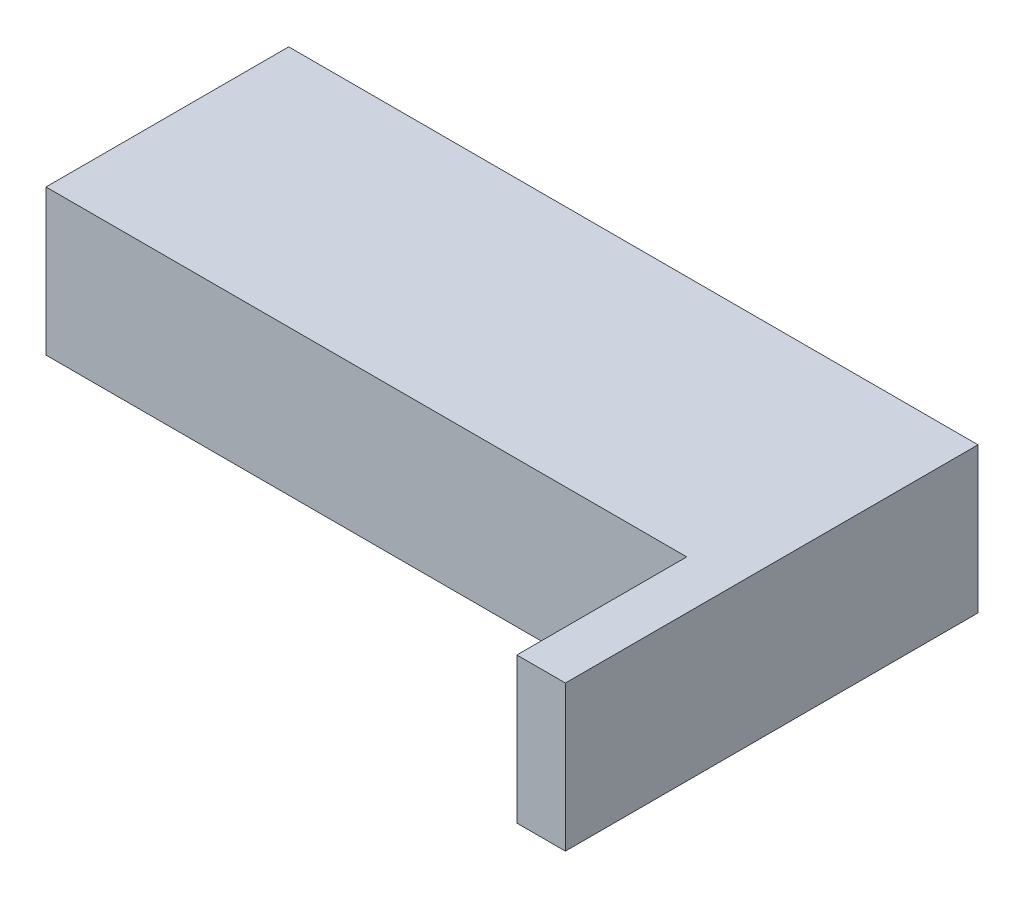
ISO-10303-21;
HEADER;
FILE_DESCRIPTION(('STEP AP214'),'2;1');
FILE_NAME('part.step','',(''),(''),'','','');
FILE_SCHEMA(('AUTOMOTIVE_DESIGN { 1 0 10303 214 1 1 1 1 }'));
ENDSEC;
DATA;
#1=APPLICATION_CONTEXT('core data for automotive mechanical design processes');
#2=APPLICATION_PROTOCOL_DEFINITION('international standard','automotive_design',2000,#1);
#3=PRODUCT_CONTEXT('',#1,'mechanical');
#4=PRODUCT('Part','Part','',(#3));
#5=PRODUCT_RELATED_PRODUCT_CATEGORY('part','',(#4));
#6=PRODUCT_DEFINITION_FORMATION('','',#4);
#7=PRODUCT_DEFINITION_CONTEXT('part definition',#1,'design');
#8=PRODUCT_DEFINITION('design','',#6,#7);
#9=PRODUCT_DEFINITION_SHAPE('','',#8);
#10=(LENGTH_UNIT() NAMED_UNIT(*) SI_UNIT(.MILLI.,.METRE.));
#11=(NAMED_UNIT(*) PLANE_ANGLE_UNIT() SI_UNIT($,.RADIAN.));
#12=(NAMED_UNIT(*) SI_UNIT($,.STERADIAN.) SOLID_ANGLE_UNIT());
#13=UNCERTAINTY_MEASURE_WITH_UNIT(LENGTH_MEASURE(1.E-05),#10,'distance_accuracy_value','');
#14=(GEOMETRIC_REPRESENTATION_CONTEXT(3) GLOBAL_UNCERTAINTY_ASSIGNED_CONTEXT((#13)) GLOBAL_UNIT_ASSIGNED_CONTEXT((#10,
#11,#12)) REPRESENTATION_CONTEXT('',''));
#15=CARTESIAN_POINT('',(0.,0.,0.));
#16=DIRECTION('',(0.,0.,1.));
#17=DIRECTION('',(1.,0.,0.));
#18=AXIS2_PLACEMENT_3D('',#15,#16,#17);
#19=CARTESIAN_POINT('',(0.,30.,0.));
#20=DIRECTION('',(0.,0.,-1.));
#21=DIRECTION('',(-1.,0.,0.));
#22=AXIS2_PLACEMENT_3D('',#19,#20,#21);
#23=PLANE('',#22);
#24=DIRECTION('',(0.,-1.,0.));
#25=VECTOR('',#24,1.);
#26=CARTESIAN_POINT('',(132.,30.,0.));
#27=LINE('',#26,#25);
#28=CARTESIAN_POINT('',(132.,30.,0.));
#29=VERTEX_POINT('',#28);
#30=CARTESIAN_POINT('',(132.,0.,0.));
#31=VERTEX_POINT('',#30);
#32=EDGE_CURVE('E48',#29,#31,#27,.T.);
#33=ORIENTED_EDGE('',*,*,#32,.F.);
#34=DIRECTION('',(1.,0.,0.));
#35=VECTOR('',#34,1.);
#36=CARTESIAN_POINT('',(0.,30.,0.));
#37=LINE('',#36,#35);
#38=CARTESIAN_POINT('',(0.,30.,0.));
#39=VERTEX_POINT('',#38);
#40=EDGE_CURVE('E76',#39,#29,#37,.T.);
#41=ORIENTED_EDGE('',*,*,#40,.F.);
#42=DIRECTION('',(0.,-1.,0.));
#43=VECTOR('',#42,1.);
#44=CARTESIAN_POINT('',(0.,30.,0.));
#45=LINE('',#44,#43);
#46=CARTESIAN_POINT('',(0.,0.,0.));
#47=VERTEX_POINT('',#46);
#48=EDGE_CURVE('E11',#39,#47,#45,.T.);
#49=ORIENTED_EDGE('',*,*,#48,.T.);
#50=DIRECTION('',(1.,0.,0.));
#51=VECTOR('',#50,1.);
#52=CARTESIAN_POINT('',(0.,0.,0.));
#53=LINE('',#52,#51);
#54=EDGE_CURVE('E119',#47,#31,#53,.T.);
#55=ORIENTED_EDGE('',*,*,#54,.T.);
#56=EDGE_LOOP('',(#33,#41,#49,#55));
#57=FACE_BOUND('',#56,.T.);
#58=ADVANCED_FACE('F33',(#57),#23,.F.);
#59=CARTESIAN_POINT('',(0.,30.,0.));
#60=DIRECTION('',(1.,0.,0.));
#61=DIRECTION('',(0.,0.,-1.));
#62=AXIS2_PLACEMENT_3D('',#59,#60,#61);
#63=PLANE('',#62);
#64=DIRECTION('',(0.,0.,1.));
#65=VECTOR('',#64,1.);
#66=CARTESIAN_POINT('',(0.,0.,0.));
#67=LINE('',#66,#65);
#68=CARTESIAN_POINT('',(0.,0.,-50.));
#69=VERTEX_POINT('',#68);
#70=EDGE_CURVE('E115',#69,#47,#67,.T.);
#71=ORIENTED_EDGE('',*,*,#70,.T.);
#72=ORIENTED_EDGE('',*,*,#48,.F.);
#73=DIRECTION('',(0.,0.,1.));
#74=VECTOR('',#73,1.);
#75=CARTESIAN_POINT('',(0.,30.,0.));
#76=LINE('',#75,#74);
#77=CARTESIAN_POINT('',(0.,30.,-50.));
#78=VERTEX_POINT('',#77);
#79=EDGE_CURVE('E124',#78,#39,#76,.T.);
#80=ORIENTED_EDGE('',*,*,#79,.F.);
#81=DIRECTION('',(0.,-1.,0.));
#82=VECTOR('',#81,1.);
#83=CARTESIAN_POINT('',(0.,30.,-50.));
#84=LINE('',#83,#82);
#85=EDGE_CURVE('E129',#78,#69,#84,.T.);
#86=ORIENTED_EDGE('',*,*,#85,.T.);
#87=EDGE_LOOP('',(#71,#72,#80,#86));
#88=FACE_BOUND('',#87,.T.);
#89=ADVANCED_FACE('F35',(#88),#63,.F.);
#90=CARTESIAN_POINT('',(142.,30.,0.));
#91=DIRECTION('',(-1.,0.,0.));
#92=DIRECTION('',(0.,0.,1.));
#93=AXIS2_PLACEMENT_3D('',#90,#91,#92);
#94=PLANE('',#93);
#95=DIRECTION('',(0.,0.,-1.));
#96=VECTOR('',#95,1.);
#97=CARTESIAN_POINT('',(142.,0.,0.));
#98=LINE('',#97,#96);
#99=CARTESIAN_POINT('',(142.,0.,35.));
#100=VERTEX_POINT('',#99);
#101=CARTESIAN_POINT('',(142.,0.,-50.));
#102=VERTEX_POINT('',#101);
#103=EDGE_CURVE('E99',#100,#102,#98,.T.);
#104=ORIENTED_EDGE('',*,*,#103,.T.);
#105=DIRECTION('',(0.,-1.,0.));
#106=VECTOR('',#105,1.);
#107=CARTESIAN_POINT('',(142.,30.,-50.));
#108=LINE('',#107,#106);
#109=CARTESIAN_POINT('',(142.,30.,-50.));
#110=VERTEX_POINT('',#109);
#111=EDGE_CURVE('E41',#110,#102,#108,.T.);
#112=ORIENTED_EDGE('',*,*,#111,.F.);
#113=DIRECTION('',(0.,0.,-1.));
#114=VECTOR('',#113,1.);
#115=CARTESIAN_POINT('',(142.,30.,0.));
#116=LINE('',#115,#114);
#117=CARTESIAN_POINT('',(142.,30.,35.));
#118=VERTEX_POINT('',#117);
#119=EDGE_CURVE('E127',#118,#110,#116,.T.);
#120=ORIENTED_EDGE('',*,*,#119,.F.);
#121=DIRECTION('',(0.,1.,0.));
#122=VECTOR('',#121,1.);
#123=CARTESIAN_POINT('',(142.,30.,35.));
#124=LINE('',#123,#122);
#125=EDGE_CURVE('E103',#100,#118,#124,.T.);
#126=ORIENTED_EDGE('',*,*,#125,.F.);
#127=EDGE_LOOP('',(#104,#112,#120,#126));
#128=FACE_BOUND('',#127,.T.);
#129=ADVANCED_FACE('F143',(#128),#94,.F.);
#130=CARTESIAN_POINT('',(0.,30.,-50.));
#131=DIRECTION('',(0.,0.,1.));
#132=DIRECTION('',(1.,0.,0.));
#133=AXIS2_PLACEMENT_3D('',#130,#131,#132);
#134=PLANE('',#133);
#135=DIRECTION('',(-1.,0.,0.));
#136=VECTOR('',#135,1.);
#137=CARTESIAN_POINT('',(0.,0.,-50.));
#138=LINE('',#137,#136);
#139=EDGE_CURVE('E74',#102,#69,#138,.T.);
#140=ORIENTED_EDGE('',*,*,#139,.T.);
#141=ORIENTED_EDGE('',*,*,#85,.F.);
#142=DIRECTION('',(-1.,0.,0.));
#143=VECTOR('',#142,1.);
#144=CARTESIAN_POINT('',(0.,30.,-50.));
#145=LINE('',#144,#143);
#146=EDGE_CURVE('E57',#110,#78,#145,.T.);
#147=ORIENTED_EDGE('',*,*,#146,.F.);
#148=ORIENTED_EDGE('',*,*,#111,.T.);
#149=EDGE_LOOP('',(#140,#141,#147,#148));
#150=FACE_BOUND('',#149,.T.);
#151=ADVANCED_FACE('F135',(#150),#134,.F.);
#152=CARTESIAN_POINT('',(0.,30.,0.));
#153=DIRECTION('',(0.,-1.,0.));
#154=DIRECTION('',(0.,0.,-1.));
#155=AXIS2_PLACEMENT_3D('',#152,#153,#154);
#156=PLANE('',#155);
#157=ORIENTED_EDGE('',*,*,#79,.T.);
#158=ORIENTED_EDGE('',*,*,#40,.T.);
#159=DIRECTION('',(0.,0.,-1.));
#160=VECTOR('',#159,1.);
#161=CARTESIAN_POINT('',(132.,30.,35.));
#162=LINE('',#161,#160);
#163=CARTESIAN_POINT('',(132.,30.,35.));
#164=VERTEX_POINT('',#163);
#165=EDGE_CURVE('E116',#164,#29,#162,.T.);
#166=ORIENTED_EDGE('',*,*,#165,.F.);
#167=DIRECTION('',(-1.,0.,0.));
#168=VECTOR('',#167,1.);
#169=CARTESIAN_POINT('',(132.,30.,35.));
#170=LINE('',#169,#168);
#171=EDGE_CURVE('E109',#118,#164,#170,.T.);
#172=ORIENTED_EDGE('',*,*,#171,.F.);
#173=ORIENTED_EDGE('',*,*,#119,.T.);
#174=ORIENTED_EDGE('',*,*,#146,.T.);
#175=EDGE_LOOP('',(#157,#158,#166,#172,#173,#174));
#176=FACE_BOUND('',#175,.T.);
#177=ADVANCED_FACE('F140',(#176),#156,.F.);
#178=CARTESIAN_POINT('',(0.,0.,0.));
#179=DIRECTION('',(0.,-1.,0.));
#180=DIRECTION('',(0.,0.,-1.));
#181=AXIS2_PLACEMENT_3D('',#178,#179,#180);
#182=PLANE('',#181);
#183=ORIENTED_EDGE('',*,*,#70,.F.);
#184=ORIENTED_EDGE('',*,*,#139,.F.);
#185=ORIENTED_EDGE('',*,*,#103,.F.);
#186=DIRECTION('',(1.,0.,0.));
#187=VECTOR('',#186,1.);
#188=CARTESIAN_POINT('',(132.,0.,35.));
#189=LINE('',#188,#187);
#190=CARTESIAN_POINT('',(132.,0.,35.));
#191=VERTEX_POINT('',#190);
#192=EDGE_CURVE('E93',#191,#100,#189,.T.);
#193=ORIENTED_EDGE('',*,*,#192,.F.);
#194=DIRECTION('',(0.,0.,-1.));
#195=VECTOR('',#194,1.);
#196=CARTESIAN_POINT('',(132.,0.,35.));
#197=LINE('',#196,#195);
#198=EDGE_CURVE('E98',#191,#31,#197,.T.);
#199=ORIENTED_EDGE('',*,*,#198,.T.);
#200=ORIENTED_EDGE('',*,*,#54,.F.);
#201=EDGE_LOOP('',(#183,#184,#185,#193,#199,#200));
#202=FACE_BOUND('',#201,.T.);
#203=ADVANCED_FACE('F96',(#202),#182,.T.);
#204=CARTESIAN_POINT('',(132.,30.,35.));
#205=DIRECTION('',(1.,0.,0.));
#206=DIRECTION('',(0.,0.,-1.));
#207=AXIS2_PLACEMENT_3D('',#204,#205,#206);
#208=PLANE('',#207);
#209=ORIENTED_EDGE('',*,*,#32,.T.);
#210=ORIENTED_EDGE('',*,*,#198,.F.);
#211=DIRECTION('',(0.,-1.,0.));
#212=VECTOR('',#211,1.);
#213=CARTESIAN_POINT('',(132.,30.,35.));
#214=LINE('',#213,#212);
#215=EDGE_CURVE('E104',#164,#191,#214,.T.);
#216=ORIENTED_EDGE('',*,*,#215,.F.);
#217=ORIENTED_EDGE('',*,*,#165,.T.);
#218=EDGE_LOOP('',(#209,#210,#216,#217));
#219=FACE_BOUND('',#218,.T.);
#220=ADVANCED_FACE('F114',(#219),#208,.F.);
#221=CARTESIAN_POINT('',(0.,0.,35.));
#222=DIRECTION('',(0.,0.,1.));
#223=DIRECTION('',(1.,0.,0.));
#224=AXIS2_PLACEMENT_3D('',#221,#222,#223);
#225=PLANE('',#224);
#226=ORIENTED_EDGE('',*,*,#215,.T.);
#227=ORIENTED_EDGE('',*,*,#192,.T.);
#228=ORIENTED_EDGE('',*,*,#125,.T.);
#229=ORIENTED_EDGE('',*,*,#171,.T.);
#230=EDGE_LOOP('',(#226,#227,#228,#229));
#231=FACE_BOUND('',#230,.T.);
#232=ADVANCED_FACE('F107',(#231),#225,.T.);
#233=CLOSED_SHELL('',(#58,#89,#129,#151,#177,#203,#220,#232));
#234=MANIFOLD_SOLID_BREP('B2',#233);
#235=ADVANCED_BREP_SHAPE_REPRESENTATION('',(#18,#234),#14);
#236=SHAPE_DEFINITION_REPRESENTATION(#9,#235);
ENDSEC;
END-ISO-10303-21;
